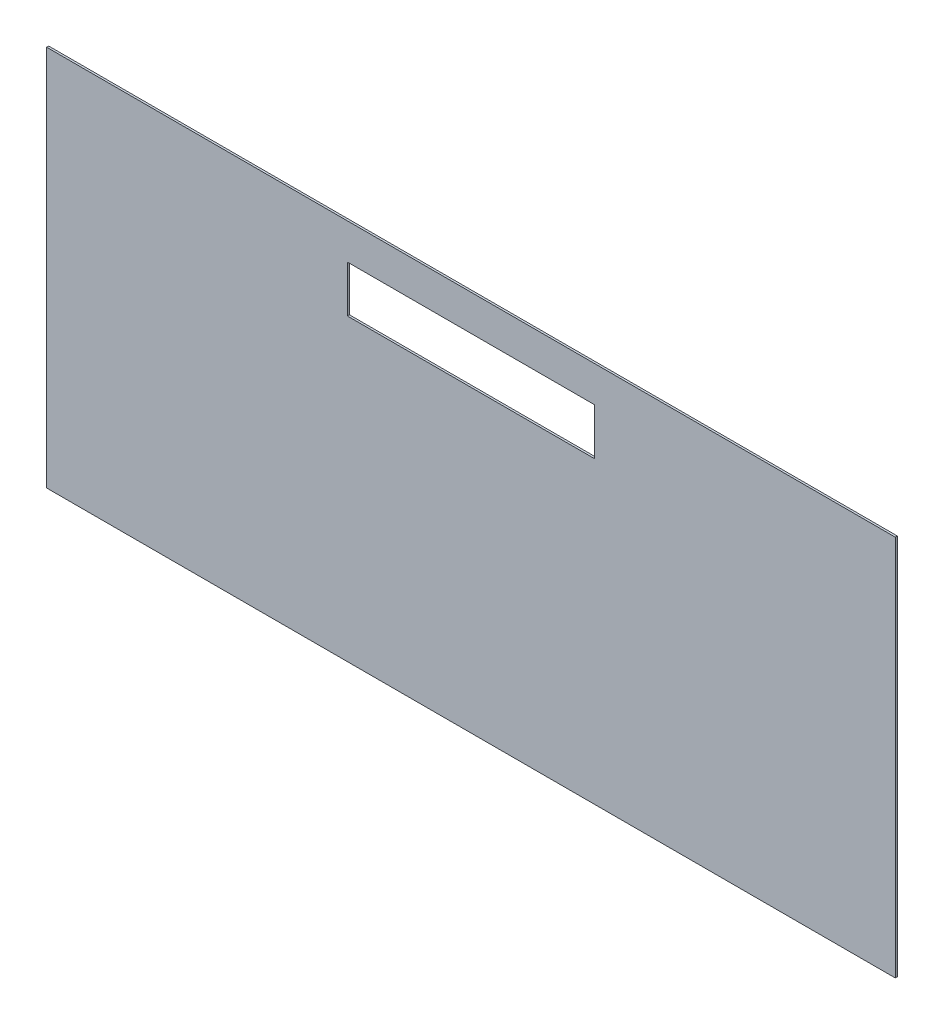
ISO-10303-21;
HEADER;
FILE_DESCRIPTION(('STEP AP214'),'2;1');
FILE_NAME('part.step','',(''),(''),'','','');
FILE_SCHEMA(('AUTOMOTIVE_DESIGN { 1 0 10303 214 1 1 1 1 }'));
ENDSEC;
DATA;
#1=APPLICATION_CONTEXT('core data for automotive mechanical design processes');
#2=APPLICATION_PROTOCOL_DEFINITION('international standard','automotive_design',2000,#1);
#3=PRODUCT_CONTEXT('',#1,'mechanical');
#4=PRODUCT('Part','Part','',(#3));
#5=PRODUCT_RELATED_PRODUCT_CATEGORY('part','',(#4));
#6=PRODUCT_DEFINITION_FORMATION('','',#4);
#7=PRODUCT_DEFINITION_CONTEXT('part definition',#1,'design');
#8=PRODUCT_DEFINITION('design','',#6,#7);
#9=PRODUCT_DEFINITION_SHAPE('','',#8);
#10=(LENGTH_UNIT() NAMED_UNIT(*) SI_UNIT(.MILLI.,.METRE.));
#11=(NAMED_UNIT(*) PLANE_ANGLE_UNIT() SI_UNIT($,.RADIAN.));
#12=(NAMED_UNIT(*) SI_UNIT($,.STERADIAN.) SOLID_ANGLE_UNIT());
#13=UNCERTAINTY_MEASURE_WITH_UNIT(LENGTH_MEASURE(1.E-05),#10,'distance_accuracy_value','');
#14=(GEOMETRIC_REPRESENTATION_CONTEXT(3) GLOBAL_UNCERTAINTY_ASSIGNED_CONTEXT((#13)) GLOBAL_UNIT_ASSIGNED_CONTEXT((#10,
#11,#12)) REPRESENTATION_CONTEXT('',''));
#15=CARTESIAN_POINT('',(0.,0.,0.));
#16=DIRECTION('',(0.,0.,1.));
#17=DIRECTION('',(1.,0.,0.));
#18=AXIS2_PLACEMENT_3D('',#15,#16,#17);
#19=CARTESIAN_POINT('',(0.,0.,40.));
#20=DIRECTION('',(0.,0.,-1.));
#21=DIRECTION('',(-1.,0.,0.));
#22=AXIS2_PLACEMENT_3D('',#19,#20,#21);
#23=PLANE('',#22);
#24=DIRECTION('',(0.,-1.,0.));
#25=VECTOR('',#24,1.);
#26=CARTESIAN_POINT('',(69.,406.,40.));
#27=LINE('',#26,#25);
#28=CARTESIAN_POINT('',(69.,684.,40.));
#29=VERTEX_POINT('',#28);
#30=CARTESIAN_POINT('',(69.,406.,40.));
#31=VERTEX_POINT('',#30);
#32=EDGE_CURVE('E126',#29,#31,#27,.T.);
#33=ORIENTED_EDGE('',*,*,#32,.T.);
#34=DIRECTION('',(1.,0.,0.));
#35=VECTOR('',#34,1.);
#36=CARTESIAN_POINT('',(69.,406.,40.));
#37=LINE('',#36,#35);
#38=CARTESIAN_POINT('',(687.,406.,40.));
#39=VERTEX_POINT('',#38);
#40=EDGE_CURVE('E129',#31,#39,#37,.T.);
#41=ORIENTED_EDGE('',*,*,#40,.T.);
#42=DIRECTION('',(0.,1.,0.));
#43=VECTOR('',#42,1.);
#44=CARTESIAN_POINT('',(687.,406.,40.));
#45=LINE('',#44,#43);
#46=CARTESIAN_POINT('',(687.,684.,40.));
#47=VERTEX_POINT('',#46);
#48=EDGE_CURVE('E132',#39,#47,#45,.T.);
#49=ORIENTED_EDGE('',*,*,#48,.T.);
#50=DIRECTION('',(-1.,0.,0.));
#51=VECTOR('',#50,1.);
#52=CARTESIAN_POINT('',(69.,684.,40.));
#53=LINE('',#52,#51);
#54=EDGE_CURVE('E134',#47,#29,#53,.T.);
#55=ORIENTED_EDGE('',*,*,#54,.T.);
#56=EDGE_LOOP('',(#33,#41,#49,#55));
#57=FACE_BOUND('',#56,.T.);
#58=DIRECTION('',(0.,-1.,0.));
#59=VECTOR('',#58,1.);
#60=CARTESIAN_POINT('',(288.,0.,40.));
#61=LINE('',#60,#59);
#62=CARTESIAN_POINT('',(288.,658.,40.));
#63=VERTEX_POINT('',#62);
#64=CARTESIAN_POINT('',(288.,624.,40.));
#65=VERTEX_POINT('',#64);
#66=EDGE_CURVE('E112',#63,#65,#61,.T.);
#67=ORIENTED_EDGE('',*,*,#66,.F.);
#68=DIRECTION('',(-1.,0.,0.));
#69=VECTOR('',#68,1.);
#70=CARTESIAN_POINT('',(0.,658.,40.));
#71=LINE('',#70,#69);
#72=CARTESIAN_POINT('',(468.,658.,40.));
#73=VERTEX_POINT('',#72);
#74=EDGE_CURVE('E101',#73,#63,#71,.T.);
#75=ORIENTED_EDGE('',*,*,#74,.F.);
#76=DIRECTION('',(0.,1.,0.));
#77=VECTOR('',#76,1.);
#78=CARTESIAN_POINT('',(468.,0.,40.));
#79=LINE('',#78,#77);
#80=CARTESIAN_POINT('',(468.,624.,40.));
#81=VERTEX_POINT('',#80);
#82=EDGE_CURVE('E106',#81,#73,#79,.T.);
#83=ORIENTED_EDGE('',*,*,#82,.F.);
#84=DIRECTION('',(1.,0.,0.));
#85=VECTOR('',#84,1.);
#86=CARTESIAN_POINT('',(0.,624.,40.));
#87=LINE('',#86,#85);
#88=EDGE_CURVE('E117',#65,#81,#87,.T.);
#89=ORIENTED_EDGE('',*,*,#88,.F.);
#90=EDGE_LOOP('',(#67,#75,#83,#89));
#91=FACE_BOUND('',#90,.T.);
#92=ADVANCED_FACE('F39',(#57,#91),#23,.F.);
#93=CARTESIAN_POINT('',(0.,0.,38.5));
#94=DIRECTION('',(0.,0.,-1.));
#95=DIRECTION('',(-1.,0.,0.));
#96=AXIS2_PLACEMENT_3D('',#93,#94,#95);
#97=PLANE('',#96);
#98=DIRECTION('',(0.,-1.,0.));
#99=VECTOR('',#98,1.);
#100=CARTESIAN_POINT('',(69.,406.,38.5));
#101=LINE('',#100,#99);
#102=CARTESIAN_POINT('',(69.,684.,38.5));
#103=VERTEX_POINT('',#102);
#104=CARTESIAN_POINT('',(69.,406.,38.5));
#105=VERTEX_POINT('',#104);
#106=EDGE_CURVE('E118',#103,#105,#101,.T.);
#107=ORIENTED_EDGE('',*,*,#106,.F.);
#108=DIRECTION('',(-1.,0.,0.));
#109=VECTOR('',#108,1.);
#110=CARTESIAN_POINT('',(69.,684.,38.5));
#111=LINE('',#110,#109);
#112=CARTESIAN_POINT('',(687.,684.,38.5));
#113=VERTEX_POINT('',#112);
#114=EDGE_CURVE('E130',#113,#103,#111,.T.);
#115=ORIENTED_EDGE('',*,*,#114,.F.);
#116=DIRECTION('',(0.,1.,0.));
#117=VECTOR('',#116,1.);
#118=CARTESIAN_POINT('',(687.,406.,38.5));
#119=LINE('',#118,#117);
#120=CARTESIAN_POINT('',(687.,406.,38.5));
#121=VERTEX_POINT('',#120);
#122=EDGE_CURVE('E138',#121,#113,#119,.T.);
#123=ORIENTED_EDGE('',*,*,#122,.F.);
#124=DIRECTION('',(1.,0.,0.));
#125=VECTOR('',#124,1.);
#126=CARTESIAN_POINT('',(69.,406.,38.5));
#127=LINE('',#126,#125);
#128=EDGE_CURVE('E121',#105,#121,#127,.T.);
#129=ORIENTED_EDGE('',*,*,#128,.F.);
#130=EDGE_LOOP('',(#107,#115,#123,#129));
#131=FACE_BOUND('',#130,.T.);
#132=DIRECTION('',(-1.,0.,0.));
#133=VECTOR('',#132,1.);
#134=CARTESIAN_POINT('',(0.,658.,38.5));
#135=LINE('',#134,#133);
#136=CARTESIAN_POINT('',(468.,658.,38.5));
#137=VERTEX_POINT('',#136);
#138=CARTESIAN_POINT('',(288.,658.,38.5));
#139=VERTEX_POINT('',#138);
#140=EDGE_CURVE('E152',#137,#139,#135,.T.);
#141=ORIENTED_EDGE('',*,*,#140,.T.);
#142=DIRECTION('',(0.,-1.,0.));
#143=VECTOR('',#142,1.);
#144=CARTESIAN_POINT('',(288.,0.,38.5));
#145=LINE('',#144,#143);
#146=CARTESIAN_POINT('',(288.,624.,38.5));
#147=VERTEX_POINT('',#146);
#148=EDGE_CURVE('E11',#139,#147,#145,.T.);
#149=ORIENTED_EDGE('',*,*,#148,.T.);
#150=DIRECTION('',(1.,0.,0.));
#151=VECTOR('',#150,1.);
#152=CARTESIAN_POINT('',(0.,624.,38.5));
#153=LINE('',#152,#151);
#154=CARTESIAN_POINT('',(468.,624.,38.5));
#155=VERTEX_POINT('',#154);
#156=EDGE_CURVE('E47',#147,#155,#153,.T.);
#157=ORIENTED_EDGE('',*,*,#156,.T.);
#158=DIRECTION('',(0.,1.,0.));
#159=VECTOR('',#158,1.);
#160=CARTESIAN_POINT('',(468.,0.,38.5));
#161=LINE('',#160,#159);
#162=EDGE_CURVE('E154',#155,#137,#161,.T.);
#163=ORIENTED_EDGE('',*,*,#162,.T.);
#164=EDGE_LOOP('',(#141,#149,#157,#163));
#165=FACE_BOUND('',#164,.T.);
#166=ADVANCED_FACE('F158',(#131,#165),#97,.T.);
#167=CARTESIAN_POINT('',(69.,406.,40.));
#168=DIRECTION('',(1.,0.,0.));
#169=DIRECTION('',(0.,0.,-1.));
#170=AXIS2_PLACEMENT_3D('',#167,#168,#169);
#171=PLANE('',#170);
#172=ORIENTED_EDGE('',*,*,#106,.T.);
#173=DIRECTION('',(0.,0.,-1.));
#174=VECTOR('',#173,1.);
#175=CARTESIAN_POINT('',(69.,406.,40.));
#176=LINE('',#175,#174);
#177=EDGE_CURVE('E149',#31,#105,#176,.T.);
#178=ORIENTED_EDGE('',*,*,#177,.F.);
#179=ORIENTED_EDGE('',*,*,#32,.F.);
#180=DIRECTION('',(0.,0.,-1.));
#181=VECTOR('',#180,1.);
#182=CARTESIAN_POINT('',(69.,684.,40.));
#183=LINE('',#182,#181);
#184=EDGE_CURVE('E135',#29,#103,#183,.T.);
#185=ORIENTED_EDGE('',*,*,#184,.T.);
#186=EDGE_LOOP('',(#172,#178,#179,#185));
#187=FACE_BOUND('',#186,.T.);
#188=ADVANCED_FACE('F41',(#187),#171,.F.);
#189=CARTESIAN_POINT('',(69.,406.,40.));
#190=DIRECTION('',(0.,1.,0.));
#191=DIRECTION('',(0.,0.,1.));
#192=AXIS2_PLACEMENT_3D('',#189,#190,#191);
#193=PLANE('',#192);
#194=ORIENTED_EDGE('',*,*,#128,.T.);
#195=DIRECTION('',(0.,0.,-1.));
#196=VECTOR('',#195,1.);
#197=CARTESIAN_POINT('',(687.,406.,40.));
#198=LINE('',#197,#196);
#199=EDGE_CURVE('E146',#39,#121,#198,.T.);
#200=ORIENTED_EDGE('',*,*,#199,.F.);
#201=ORIENTED_EDGE('',*,*,#40,.F.);
#202=ORIENTED_EDGE('',*,*,#177,.T.);
#203=EDGE_LOOP('',(#194,#200,#201,#202));
#204=FACE_BOUND('',#203,.T.);
#205=ADVANCED_FACE('F193',(#204),#193,.F.);
#206=CARTESIAN_POINT('',(687.,406.,40.));
#207=DIRECTION('',(-1.,0.,0.));
#208=DIRECTION('',(0.,0.,1.));
#209=AXIS2_PLACEMENT_3D('',#206,#207,#208);
#210=PLANE('',#209);
#211=ORIENTED_EDGE('',*,*,#122,.T.);
#212=DIRECTION('',(0.,0.,-1.));
#213=VECTOR('',#212,1.);
#214=CARTESIAN_POINT('',(687.,684.,40.));
#215=LINE('',#214,#213);
#216=EDGE_CURVE('E143',#47,#113,#215,.T.);
#217=ORIENTED_EDGE('',*,*,#216,.F.);
#218=ORIENTED_EDGE('',*,*,#48,.F.);
#219=ORIENTED_EDGE('',*,*,#199,.T.);
#220=EDGE_LOOP('',(#211,#217,#218,#219));
#221=FACE_BOUND('',#220,.T.);
#222=ADVANCED_FACE('F190',(#221),#210,.F.);
#223=CARTESIAN_POINT('',(69.,684.,40.));
#224=DIRECTION('',(0.,-1.,0.));
#225=DIRECTION('',(0.,0.,-1.));
#226=AXIS2_PLACEMENT_3D('',#223,#224,#225);
#227=PLANE('',#226);
#228=ORIENTED_EDGE('',*,*,#114,.T.);
#229=ORIENTED_EDGE('',*,*,#184,.F.);
#230=ORIENTED_EDGE('',*,*,#54,.F.);
#231=ORIENTED_EDGE('',*,*,#216,.T.);
#232=EDGE_LOOP('',(#228,#229,#230,#231));
#233=FACE_BOUND('',#232,.T.);
#234=ADVANCED_FACE('F188',(#233),#227,.F.);
#235=CARTESIAN_POINT('',(288.,624.,41.));
#236=DIRECTION('',(1.,0.,0.));
#237=DIRECTION('',(0.,0.,-1.));
#238=AXIS2_PLACEMENT_3D('',#235,#236,#237);
#239=PLANE('',#238);
#240=ORIENTED_EDGE('',*,*,#66,.T.);
#241=DIRECTION('',(0.,0.,-1.));
#242=VECTOR('',#241,1.);
#243=CARTESIAN_POINT('',(288.,624.,41.));
#244=LINE('',#243,#242);
#245=EDGE_CURVE('E107',#65,#147,#244,.T.);
#246=ORIENTED_EDGE('',*,*,#245,.T.);
#247=ORIENTED_EDGE('',*,*,#148,.F.);
#248=DIRECTION('',(0.,0.,-1.));
#249=VECTOR('',#248,1.);
#250=CARTESIAN_POINT('',(288.,658.,41.));
#251=LINE('',#250,#249);
#252=EDGE_CURVE('E59',#63,#139,#251,.T.);
#253=ORIENTED_EDGE('',*,*,#252,.F.);
#254=EDGE_LOOP('',(#240,#246,#247,#253));
#255=FACE_BOUND('',#254,.T.);
#256=ADVANCED_FACE('F110',(#255),#239,.T.);
#257=CARTESIAN_POINT('',(288.,624.,41.));
#258=DIRECTION('',(0.,1.,0.));
#259=DIRECTION('',(0.,0.,1.));
#260=AXIS2_PLACEMENT_3D('',#257,#258,#259);
#261=PLANE('',#260);
#262=ORIENTED_EDGE('',*,*,#88,.T.);
#263=DIRECTION('',(0.,0.,-1.));
#264=VECTOR('',#263,1.);
#265=CARTESIAN_POINT('',(468.,624.,41.));
#266=LINE('',#265,#264);
#267=EDGE_CURVE('E163',#81,#155,#266,.T.);
#268=ORIENTED_EDGE('',*,*,#267,.T.);
#269=ORIENTED_EDGE('',*,*,#156,.F.);
#270=ORIENTED_EDGE('',*,*,#245,.F.);
#271=EDGE_LOOP('',(#262,#268,#269,#270));
#272=FACE_BOUND('',#271,.T.);
#273=ADVANCED_FACE('F161',(#272),#261,.T.);
#274=CARTESIAN_POINT('',(468.,624.,41.));
#275=DIRECTION('',(-1.,0.,0.));
#276=DIRECTION('',(0.,0.,1.));
#277=AXIS2_PLACEMENT_3D('',#274,#275,#276);
#278=PLANE('',#277);
#279=ORIENTED_EDGE('',*,*,#82,.T.);
#280=DIRECTION('',(0.,0.,-1.));
#281=VECTOR('',#280,1.);
#282=CARTESIAN_POINT('',(468.,658.,41.));
#283=LINE('',#282,#281);
#284=EDGE_CURVE('E54',#73,#137,#283,.T.);
#285=ORIENTED_EDGE('',*,*,#284,.T.);
#286=ORIENTED_EDGE('',*,*,#162,.F.);
#287=ORIENTED_EDGE('',*,*,#267,.F.);
#288=EDGE_LOOP('',(#279,#285,#286,#287));
#289=FACE_BOUND('',#288,.T.);
#290=ADVANCED_FACE('F168',(#289),#278,.T.);
#291=CARTESIAN_POINT('',(288.,658.,41.));
#292=DIRECTION('',(0.,-1.,0.));
#293=DIRECTION('',(0.,0.,-1.));
#294=AXIS2_PLACEMENT_3D('',#291,#292,#293);
#295=PLANE('',#294);
#296=ORIENTED_EDGE('',*,*,#74,.T.);
#297=ORIENTED_EDGE('',*,*,#252,.T.);
#298=ORIENTED_EDGE('',*,*,#140,.F.);
#299=ORIENTED_EDGE('',*,*,#284,.F.);
#300=EDGE_LOOP('',(#296,#297,#298,#299));
#301=FACE_BOUND('',#300,.T.);
#302=ADVANCED_FACE('F102',(#301),#295,.T.);
#303=CLOSED_SHELL('',(#92,#166,#188,#205,#222,#234,#256,#273,#290,#302));
#304=MANIFOLD_SOLID_BREP('B2',#303);
#305=ADVANCED_BREP_SHAPE_REPRESENTATION('',(#18,#304),#14);
#306=SHAPE_DEFINITION_REPRESENTATION(#9,#305);
ENDSEC;
END-ISO-10303-21;
